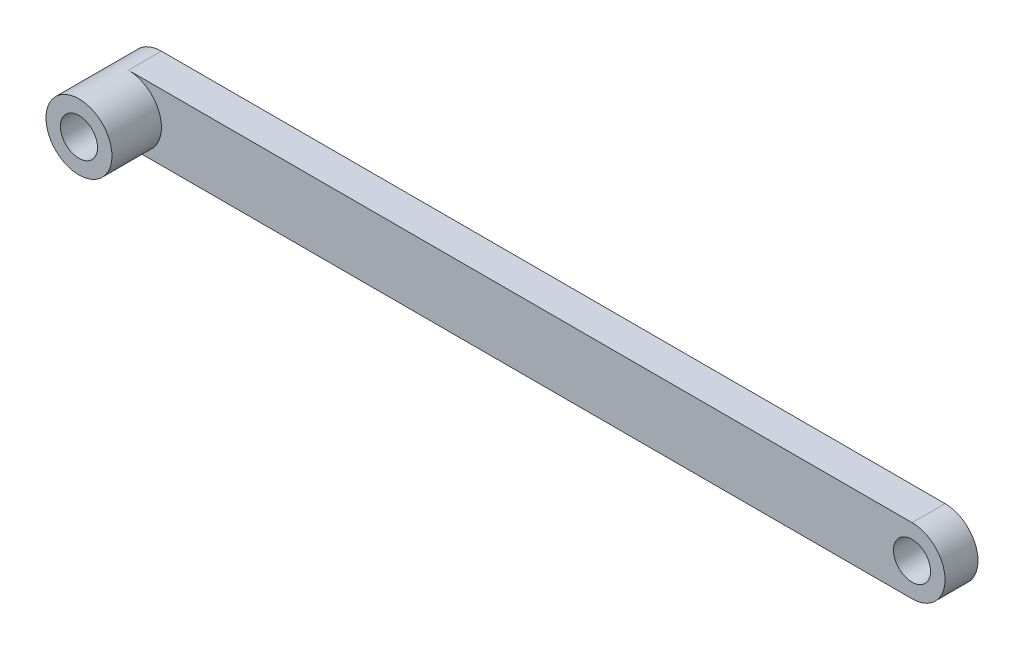
ISO-10303-21;
HEADER;
FILE_DESCRIPTION(('STEP AP214'),'2;1');
FILE_NAME('part.step','',(''),(''),'','','');
FILE_SCHEMA(('AUTOMOTIVE_DESIGN { 1 0 10303 214 1 1 1 1 }'));
ENDSEC;
DATA;
#1=APPLICATION_CONTEXT('core data for automotive mechanical design processes');
#2=APPLICATION_PROTOCOL_DEFINITION('international standard','automotive_design',2000,#1);
#3=PRODUCT_CONTEXT('',#1,'mechanical');
#4=PRODUCT('Part','Part','',(#3));
#5=PRODUCT_RELATED_PRODUCT_CATEGORY('part','',(#4));
#6=PRODUCT_DEFINITION_FORMATION('','',#4);
#7=PRODUCT_DEFINITION_CONTEXT('part definition',#1,'design');
#8=PRODUCT_DEFINITION('design','',#6,#7);
#9=PRODUCT_DEFINITION_SHAPE('','',#8);
#10=(LENGTH_UNIT() NAMED_UNIT(*) SI_UNIT(.MILLI.,.METRE.));
#11=(NAMED_UNIT(*) PLANE_ANGLE_UNIT() SI_UNIT($,.RADIAN.));
#12=(NAMED_UNIT(*) SI_UNIT($,.STERADIAN.) SOLID_ANGLE_UNIT());
#13=UNCERTAINTY_MEASURE_WITH_UNIT(LENGTH_MEASURE(1.E-05),#10,'distance_accuracy_value','');
#14=(GEOMETRIC_REPRESENTATION_CONTEXT(3) GLOBAL_UNCERTAINTY_ASSIGNED_CONTEXT((#13)) GLOBAL_UNIT_ASSIGNED_CONTEXT((#10,
#11,#12)) REPRESENTATION_CONTEXT('',''));
#15=CARTESIAN_POINT('',(0.,0.,0.));
#16=DIRECTION('',(0.,0.,1.));
#17=DIRECTION('',(1.,0.,0.));
#18=AXIS2_PLACEMENT_3D('',#15,#16,#17);
#19=CARTESIAN_POINT('',(0.,0.,10.));
#20=DIRECTION('',(0.,0.,1.));
#21=DIRECTION('',(1.,0.,0.));
#22=AXIS2_PLACEMENT_3D('',#19,#20,#21);
#23=PLANE('',#22);
#24=CARTESIAN_POINT('',(0.,0.,10.));
#25=DIRECTION('',(0.,0.,1.));
#26=DIRECTION('',(1.,0.,0.));
#27=AXIS2_PLACEMENT_3D('',#24,#25,#26);
#28=CIRCLE('',#27,2.25);
#29=CARTESIAN_POINT('',(2.25,0.,10.));
#30=VERTEX_POINT('',#29);
#31=EDGE_CURVE('E99',#30,#30,#28,.T.);
#32=ORIENTED_EDGE('',*,*,#31,.F.);
#33=EDGE_LOOP('',(#32));
#34=FACE_BOUND('',#33,.T.);
#35=CARTESIAN_POINT('',(0.,0.,10.));
#36=DIRECTION('',(0.,0.,1.));
#37=DIRECTION('',(1.,0.,0.));
#38=AXIS2_PLACEMENT_3D('',#35,#36,#37);
#39=CIRCLE('',#38,4.);
#40=CARTESIAN_POINT('',(4.,0.,10.));
#41=VERTEX_POINT('',#40);
#42=EDGE_CURVE('E107',#41,#41,#39,.T.);
#43=ORIENTED_EDGE('',*,*,#42,.T.);
#44=EDGE_LOOP('',(#43));
#45=FACE_BOUND('',#44,.T.);
#46=ADVANCED_FACE('F39',(#34,#45),#23,.T.);
#47=CARTESIAN_POINT('',(0.,-4.,10.));
#48=DIRECTION('',(0.,1.,0.));
#49=DIRECTION('',(-1.,0.,0.));
#50=AXIS2_PLACEMENT_3D('',#47,#48,#49);
#51=PLANE('',#50);
#52=DIRECTION('',(1.,0.,0.));
#53=VECTOR('',#52,1.);
#54=CARTESIAN_POINT('',(0.,-4.,4.));
#55=LINE('',#54,#53);
#56=CARTESIAN_POINT('',(0.,-4.,4.));
#57=VERTEX_POINT('',#56);
#58=CARTESIAN_POINT('',(95.,-4.00000000000001,4.));
#59=VERTEX_POINT('',#58);
#60=EDGE_CURVE('E80',#57,#59,#55,.T.);
#61=ORIENTED_EDGE('',*,*,#60,.F.);
#62=DIRECTION('',(0.,0.,-1.));
#63=VECTOR('',#62,1.);
#64=CARTESIAN_POINT('',(0.,-4.,10.));
#65=LINE('',#64,#63);
#66=CARTESIAN_POINT('',(0.,-4.,0.));
#67=VERTEX_POINT('',#66);
#68=EDGE_CURVE('E12',#57,#67,#65,.T.);
#69=ORIENTED_EDGE('',*,*,#68,.T.);
#70=DIRECTION('',(1.,0.,0.));
#71=VECTOR('',#70,1.);
#72=CARTESIAN_POINT('',(0.,-4.,0.));
#73=LINE('',#72,#71);
#74=CARTESIAN_POINT('',(95.,-4.00000000000001,0.));
#75=VERTEX_POINT('',#74);
#76=EDGE_CURVE('E98',#67,#75,#73,.T.);
#77=ORIENTED_EDGE('',*,*,#76,.T.);
#78=DIRECTION('',(0.,0.,-1.));
#79=VECTOR('',#78,1.);
#80=CARTESIAN_POINT('',(95.,-4.00000000000001,10.));
#81=LINE('',#80,#79);
#82=EDGE_CURVE('E48',#59,#75,#81,.T.);
#83=ORIENTED_EDGE('',*,*,#82,.F.);
#84=EDGE_LOOP('',(#61,#69,#77,#83));
#85=FACE_BOUND('',#84,.T.);
#86=ADVANCED_FACE('F87',(#85),#51,.F.);
#87=CARTESIAN_POINT('',(95.,0.,10.));
#88=DIRECTION('',(0.,0.,-1.));
#89=DIRECTION('',(-1.,0.,0.));
#90=AXIS2_PLACEMENT_3D('',#87,#88,#89);
#91=CYLINDRICAL_SURFACE('',#90,4.00000000000001);
#92=CARTESIAN_POINT('',(95.,0.,4.));
#93=DIRECTION('',(0.,0.,1.));
#94=DIRECTION('',(1.,0.,0.));
#95=AXIS2_PLACEMENT_3D('',#92,#93,#94);
#96=CIRCLE('',#95,4.00000000000001);
#97=CARTESIAN_POINT('',(95.,4.00000000000001,4.));
#98=VERTEX_POINT('',#97);
#99=EDGE_CURVE('E91',#59,#98,#96,.T.);
#100=ORIENTED_EDGE('',*,*,#99,.F.);
#101=ORIENTED_EDGE('',*,*,#82,.T.);
#102=CARTESIAN_POINT('',(95.,0.,0.));
#103=DIRECTION('',(0.,0.,1.));
#104=DIRECTION('',(1.,0.,0.));
#105=AXIS2_PLACEMENT_3D('',#102,#103,#104);
#106=CIRCLE('',#105,4.00000000000001);
#107=CARTESIAN_POINT('',(95.,4.00000000000001,0.));
#108=VERTEX_POINT('',#107);
#109=EDGE_CURVE('E101',#75,#108,#106,.T.);
#110=ORIENTED_EDGE('',*,*,#109,.T.);
#111=DIRECTION('',(0.,0.,-1.));
#112=VECTOR('',#111,1.);
#113=CARTESIAN_POINT('',(95.,4.00000000000001,10.));
#114=LINE('',#113,#112);
#115=EDGE_CURVE('E115',#98,#108,#114,.T.);
#116=ORIENTED_EDGE('',*,*,#115,.F.);
#117=EDGE_LOOP('',(#100,#101,#110,#116));
#118=FACE_BOUND('',#117,.T.);
#119=ADVANCED_FACE('F118',(#118),#91,.T.);
#120=CARTESIAN_POINT('',(0.,4.,10.));
#121=DIRECTION('',(0.,-1.,0.));
#122=DIRECTION('',(1.,0.,0.));
#123=AXIS2_PLACEMENT_3D('',#120,#121,#122);
#124=PLANE('',#123);
#125=DIRECTION('',(-1.,0.,0.));
#126=VECTOR('',#125,1.);
#127=CARTESIAN_POINT('',(0.,4.,4.));
#128=LINE('',#127,#126);
#129=CARTESIAN_POINT('',(0.,4.,4.));
#130=VERTEX_POINT('',#129);
#131=EDGE_CURVE('E83',#98,#130,#128,.T.);
#132=ORIENTED_EDGE('',*,*,#131,.F.);
#133=ORIENTED_EDGE('',*,*,#115,.T.);
#134=DIRECTION('',(-1.,0.,0.));
#135=VECTOR('',#134,1.);
#136=CARTESIAN_POINT('',(0.,4.,0.));
#137=LINE('',#136,#135);
#138=CARTESIAN_POINT('',(0.,4.,0.));
#139=VERTEX_POINT('',#138);
#140=EDGE_CURVE('E112',#108,#139,#137,.T.);
#141=ORIENTED_EDGE('',*,*,#140,.T.);
#142=DIRECTION('',(0.,0.,-1.));
#143=VECTOR('',#142,1.);
#144=CARTESIAN_POINT('',(0.,4.,10.));
#145=LINE('',#144,#143);
#146=EDGE_CURVE('E60',#130,#139,#145,.T.);
#147=ORIENTED_EDGE('',*,*,#146,.F.);
#148=EDGE_LOOP('',(#132,#133,#141,#147));
#149=FACE_BOUND('',#148,.T.);
#150=ADVANCED_FACE('F124',(#149),#124,.F.);
#151=CARTESIAN_POINT('',(95.,0.,10.));
#152=DIRECTION('',(0.,0.,-1.));
#153=DIRECTION('',(-1.,0.,0.));
#154=AXIS2_PLACEMENT_3D('',#151,#152,#153);
#155=CYLINDRICAL_SURFACE('',#154,2.25);
#156=CARTESIAN_POINT('',(95.,0.,0.));
#157=DIRECTION('',(0.,0.,1.));
#158=DIRECTION('',(1.,0.,0.));
#159=AXIS2_PLACEMENT_3D('',#156,#157,#158);
#160=CIRCLE('',#159,2.25);
#161=CARTESIAN_POINT('',(97.25,0.,0.));
#162=VERTEX_POINT('',#161);
#163=EDGE_CURVE('E90',#162,#162,#160,.T.);
#164=ORIENTED_EDGE('',*,*,#163,.F.);
#165=EDGE_LOOP('',(#164));
#166=FACE_BOUND('',#165,.T.);
#167=CARTESIAN_POINT('',(95.,0.,4.));
#168=DIRECTION('',(0.,0.,1.));
#169=DIRECTION('',(1.,0.,0.));
#170=AXIS2_PLACEMENT_3D('',#167,#168,#169);
#171=CIRCLE('',#170,2.25);
#172=CARTESIAN_POINT('',(97.25,0.,4.));
#173=VERTEX_POINT('',#172);
#174=EDGE_CURVE('E43',#173,#173,#171,.T.);
#175=ORIENTED_EDGE('',*,*,#174,.T.);
#176=EDGE_LOOP('',(#175));
#177=FACE_BOUND('',#176,.T.);
#178=ADVANCED_FACE('F156',(#166,#177),#155,.F.);
#179=CARTESIAN_POINT('',(0.,0.,0.));
#180=DIRECTION('',(0.,0.,1.));
#181=DIRECTION('',(1.,0.,0.));
#182=AXIS2_PLACEMENT_3D('',#179,#180,#181);
#183=PLANE('',#182);
#184=CARTESIAN_POINT('',(0.,0.,0.));
#185=DIRECTION('',(0.,0.,1.));
#186=DIRECTION('',(1.,0.,0.));
#187=AXIS2_PLACEMENT_3D('',#184,#185,#186);
#188=CIRCLE('',#187,4.);
#189=EDGE_CURVE('E95',#139,#67,#188,.T.);
#190=ORIENTED_EDGE('',*,*,#189,.F.);
#191=ORIENTED_EDGE('',*,*,#140,.F.);
#192=ORIENTED_EDGE('',*,*,#109,.F.);
#193=ORIENTED_EDGE('',*,*,#76,.F.);
#194=EDGE_LOOP('',(#190,#191,#192,#193));
#195=FACE_BOUND('',#194,.T.);
#196=CARTESIAN_POINT('',(0.,0.,0.));
#197=DIRECTION('',(0.,0.,1.));
#198=DIRECTION('',(1.,0.,0.));
#199=AXIS2_PLACEMENT_3D('',#196,#197,#198);
#200=CIRCLE('',#199,2.25);
#201=CARTESIAN_POINT('',(2.25,0.,0.));
#202=VERTEX_POINT('',#201);
#203=EDGE_CURVE('E104',#202,#202,#200,.T.);
#204=ORIENTED_EDGE('',*,*,#203,.T.);
#205=EDGE_LOOP('',(#204));
#206=FACE_BOUND('',#205,.T.);
#207=ORIENTED_EDGE('',*,*,#163,.T.);
#208=EDGE_LOOP('',(#207));
#209=FACE_BOUND('',#208,.T.);
#210=ADVANCED_FACE('F121',(#195,#206,#209),#183,.F.);
#211=CARTESIAN_POINT('',(0.,0.,10.));
#212=DIRECTION('',(0.,0.,-1.));
#213=DIRECTION('',(-1.,0.,0.));
#214=AXIS2_PLACEMENT_3D('',#211,#212,#213);
#215=CYLINDRICAL_SURFACE('',#214,4.);
#216=CARTESIAN_POINT('',(0.,0.,4.));
#217=DIRECTION('',(0.,0.,1.));
#218=DIRECTION('',(1.,0.,0.));
#219=AXIS2_PLACEMENT_3D('',#216,#217,#218);
#220=CIRCLE('',#219,4.);
#221=EDGE_CURVE('E55',#57,#130,#220,.T.);
#222=ORIENTED_EDGE('',*,*,#221,.T.);
#223=ORIENTED_EDGE('',*,*,#146,.T.);
#224=ORIENTED_EDGE('',*,*,#189,.T.);
#225=ORIENTED_EDGE('',*,*,#68,.F.);
#226=EDGE_LOOP('',(#222,#223,#224,#225));
#227=FACE_BOUND('',#226,.T.);
#228=ORIENTED_EDGE('',*,*,#42,.F.);
#229=EDGE_LOOP('',(#228));
#230=FACE_BOUND('',#229,.T.);
#231=ADVANCED_FACE('F41',(#227,#230),#215,.T.);
#232=CARTESIAN_POINT('',(0.,0.,10.));
#233=DIRECTION('',(0.,0.,-1.));
#234=DIRECTION('',(-1.,0.,0.));
#235=AXIS2_PLACEMENT_3D('',#232,#233,#234);
#236=CYLINDRICAL_SURFACE('',#235,2.25);
#237=ORIENTED_EDGE('',*,*,#31,.T.);
#238=EDGE_LOOP('',(#237));
#239=FACE_BOUND('',#238,.T.);
#240=ORIENTED_EDGE('',*,*,#203,.F.);
#241=EDGE_LOOP('',(#240));
#242=FACE_BOUND('',#241,.T.);
#243=ADVANCED_FACE('F134',(#239,#242),#236,.F.);
#244=CARTESIAN_POINT('',(0.,0.,4.));
#245=DIRECTION('',(0.,0.,1.));
#246=DIRECTION('',(1.,0.,0.));
#247=AXIS2_PLACEMENT_3D('',#244,#245,#246);
#248=PLANE('',#247);
#249=ORIENTED_EDGE('',*,*,#174,.F.);
#250=EDGE_LOOP('',(#249));
#251=FACE_BOUND('',#250,.T.);
#252=ORIENTED_EDGE('',*,*,#60,.T.);
#253=ORIENTED_EDGE('',*,*,#99,.T.);
#254=ORIENTED_EDGE('',*,*,#131,.T.);
#255=ORIENTED_EDGE('',*,*,#221,.F.);
#256=EDGE_LOOP('',(#252,#253,#254,#255));
#257=FACE_BOUND('',#256,.T.);
#258=ADVANCED_FACE('F79',(#251,#257),#248,.T.);
#259=CLOSED_SHELL('',(#46,#86,#119,#150,#178,#210,#231,#243,#258));
#260=MANIFOLD_SOLID_BREP('B2',#259);
#261=ADVANCED_BREP_SHAPE_REPRESENTATION('',(#18,#260),#14);
#262=SHAPE_DEFINITION_REPRESENTATION(#9,#261);
ENDSEC;
END-ISO-10303-21;
